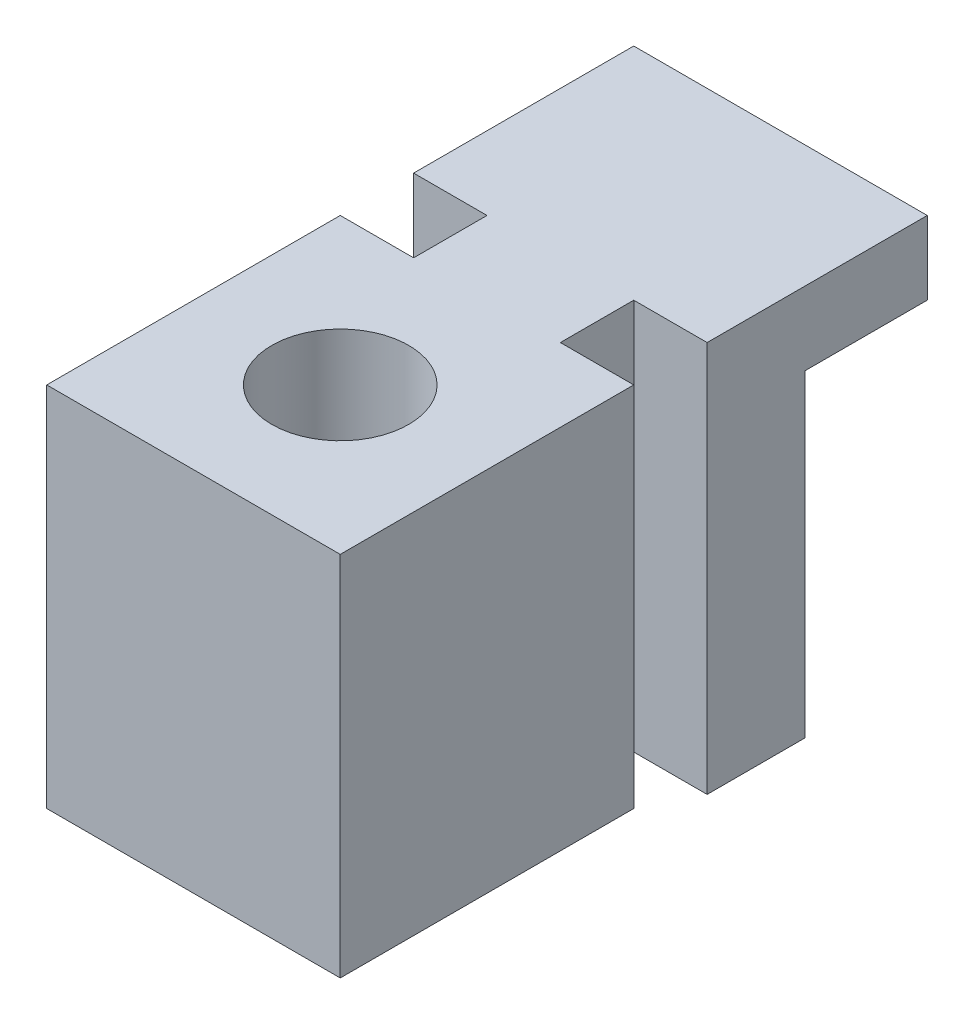
ISO-10303-21;
HEADER;
FILE_DESCRIPTION(('STEP AP214'),'2;1');
FILE_NAME('part.step','',(''),(''),'','','');
FILE_SCHEMA(('AUTOMOTIVE_DESIGN { 1 0 10303 214 1 1 1 1 }'));
ENDSEC;
DATA;
#1=APPLICATION_CONTEXT('core data for automotive mechanical design processes');
#2=APPLICATION_PROTOCOL_DEFINITION('international standard','automotive_design',2000,#1);
#3=PRODUCT_CONTEXT('',#1,'mechanical');
#4=PRODUCT('Part','Part','',(#3));
#5=PRODUCT_RELATED_PRODUCT_CATEGORY('part','',(#4));
#6=PRODUCT_DEFINITION_FORMATION('','',#4);
#7=PRODUCT_DEFINITION_CONTEXT('part definition',#1,'design');
#8=PRODUCT_DEFINITION('design','',#6,#7);
#9=PRODUCT_DEFINITION_SHAPE('','',#8);
#10=(LENGTH_UNIT() NAMED_UNIT(*) SI_UNIT(.MILLI.,.METRE.));
#11=(NAMED_UNIT(*) PLANE_ANGLE_UNIT() SI_UNIT($,.RADIAN.));
#12=(NAMED_UNIT(*) SI_UNIT($,.STERADIAN.) SOLID_ANGLE_UNIT());
#13=UNCERTAINTY_MEASURE_WITH_UNIT(LENGTH_MEASURE(1.E-05),#10,'distance_accuracy_value','');
#14=(GEOMETRIC_REPRESENTATION_CONTEXT(3) GLOBAL_UNCERTAINTY_ASSIGNED_CONTEXT((#13)) GLOBAL_UNIT_ASSIGNED_CONTEXT((#10,
#11,#12)) REPRESENTATION_CONTEXT('',''));
#15=CARTESIAN_POINT('',(0.,0.,0.));
#16=DIRECTION('',(0.,0.,1.));
#17=DIRECTION('',(1.,0.,0.));
#18=AXIS2_PLACEMENT_3D('',#15,#16,#17);
#19=CARTESIAN_POINT('',(0.,0.,0.));
#20=DIRECTION('',(0.,0.,1.));
#21=DIRECTION('',(1.,0.,0.));
#22=AXIS2_PLACEMENT_3D('',#19,#20,#21);
#23=PLANE('',#22);
#24=DIRECTION('',(-1.,0.,0.));
#25=VECTOR('',#24,1.);
#26=CARTESIAN_POINT('',(3.,3.25,0.));
#27=LINE('',#26,#25);
#28=CARTESIAN_POINT('',(3.,3.25,0.));
#29=VERTEX_POINT('',#28);
#30=CARTESIAN_POINT('',(-3.,3.25,0.));
#31=VERTEX_POINT('',#30);
#32=EDGE_CURVE('E55',#29,#31,#27,.T.);
#33=ORIENTED_EDGE('',*,*,#32,.F.);
#34=DIRECTION('',(0.,1.,0.));
#35=VECTOR('',#34,1.);
#36=CARTESIAN_POINT('',(3.,3.25,0.));
#37=LINE('',#36,#35);
#38=CARTESIAN_POINT('',(3.,-3.25,0.));
#39=VERTEX_POINT('',#38);
#40=EDGE_CURVE('E87',#39,#29,#37,.T.);
#41=ORIENTED_EDGE('',*,*,#40,.F.);
#42=DIRECTION('',(1.,0.,0.));
#43=VECTOR('',#42,1.);
#44=CARTESIAN_POINT('',(-3.,-3.25,0.));
#45=LINE('',#44,#43);
#46=CARTESIAN_POINT('',(-3.,-3.25,0.));
#47=VERTEX_POINT('',#46);
#48=EDGE_CURVE('E76',#47,#39,#45,.T.);
#49=ORIENTED_EDGE('',*,*,#48,.F.);
#50=DIRECTION('',(0.,-1.,0.));
#51=VECTOR('',#50,1.);
#52=CARTESIAN_POINT('',(-3.,3.25,0.));
#53=LINE('',#52,#51);
#54=EDGE_CURVE('E83',#31,#47,#53,.T.);
#55=ORIENTED_EDGE('',*,*,#54,.F.);
#56=EDGE_LOOP('',(#33,#41,#49,#55));
#57=FACE_BOUND('',#56,.T.);
#58=ADVANCED_FACE('F39',(#57),#23,.F.);
#59=CARTESIAN_POINT('',(3.,3.25,2.));
#60=DIRECTION('',(-1.,0.,0.));
#61=DIRECTION('',(0.,-1.,0.));
#62=AXIS2_PLACEMENT_3D('',#59,#60,#61);
#63=PLANE('',#62);
#64=ORIENTED_EDGE('',*,*,#40,.T.);
#65=DIRECTION('',(0.,0.,1.));
#66=VECTOR('',#65,1.);
#67=CARTESIAN_POINT('',(3.,3.25,-2.5));
#68=LINE('',#67,#66);
#69=CARTESIAN_POINT('',(3.,3.25,-2.5));
#70=VERTEX_POINT('',#69);
#71=EDGE_CURVE('E216',#70,#29,#68,.T.);
#72=ORIENTED_EDGE('',*,*,#71,.F.);
#73=DIRECTION('',(0.,-1.,0.));
#74=VECTOR('',#73,1.);
#75=CARTESIAN_POINT('',(3.,4.75,-2.5));
#76=LINE('',#75,#74);
#77=CARTESIAN_POINT('',(3.,4.75,-2.5));
#78=VERTEX_POINT('',#77);
#79=EDGE_CURVE('E226',#78,#70,#76,.T.);
#80=ORIENTED_EDGE('',*,*,#79,.F.);
#81=DIRECTION('',(0.,0.,-1.));
#82=VECTOR('',#81,1.);
#83=CARTESIAN_POINT('',(3.,4.75,0.));
#84=LINE('',#83,#82);
#85=CARTESIAN_POINT('',(3.,4.75,2.));
#86=VERTEX_POINT('',#85);
#87=EDGE_CURVE('E192',#86,#78,#84,.T.);
#88=ORIENTED_EDGE('',*,*,#87,.F.);
#89=DIRECTION('',(0.,1.,0.));
#90=VECTOR('',#89,1.);
#91=CARTESIAN_POINT('',(3.,3.25,2.));
#92=LINE('',#91,#90);
#93=CARTESIAN_POINT('',(3.,-3.25,2.));
#94=VERTEX_POINT('',#93);
#95=EDGE_CURVE('E82',#94,#86,#92,.T.);
#96=ORIENTED_EDGE('',*,*,#95,.F.);
#97=DIRECTION('',(0.,0.,-1.));
#98=VECTOR('',#97,1.);
#99=CARTESIAN_POINT('',(3.,-3.25,2.));
#100=LINE('',#99,#98);
#101=EDGE_CURVE('E48',#94,#39,#100,.T.);
#102=ORIENTED_EDGE('',*,*,#101,.T.);
#103=EDGE_LOOP('',(#64,#72,#80,#88,#96,#102));
#104=FACE_BOUND('',#103,.T.);
#105=ADVANCED_FACE('F41',(#104),#63,.F.);
#106=CARTESIAN_POINT('',(-3.,3.25,2.));
#107=DIRECTION('',(1.,0.,0.));
#108=DIRECTION('',(0.,1.,0.));
#109=AXIS2_PLACEMENT_3D('',#106,#107,#108);
#110=PLANE('',#109);
#111=DIRECTION('',(0.,0.,1.));
#112=VECTOR('',#111,1.);
#113=CARTESIAN_POINT('',(-3.,4.75,2.));
#114=LINE('',#113,#112);
#115=CARTESIAN_POINT('',(-3.,4.75,-2.5));
#116=VERTEX_POINT('',#115);
#117=CARTESIAN_POINT('',(-3.,4.75,2.));
#118=VERTEX_POINT('',#117);
#119=EDGE_CURVE('E188',#116,#118,#114,.T.);
#120=ORIENTED_EDGE('',*,*,#119,.F.);
#121=DIRECTION('',(0.,1.,0.));
#122=VECTOR('',#121,1.);
#123=CARTESIAN_POINT('',(-3.,4.75,-2.5));
#124=LINE('',#123,#122);
#125=CARTESIAN_POINT('',(-3.,3.25,-2.5));
#126=VERTEX_POINT('',#125);
#127=EDGE_CURVE('E230',#126,#116,#124,.T.);
#128=ORIENTED_EDGE('',*,*,#127,.F.);
#129=DIRECTION('',(0.,0.,1.));
#130=VECTOR('',#129,1.);
#131=CARTESIAN_POINT('',(-3.,3.25,-2.5));
#132=LINE('',#131,#130);
#133=EDGE_CURVE('E219',#126,#31,#132,.T.);
#134=ORIENTED_EDGE('',*,*,#133,.T.);
#135=ORIENTED_EDGE('',*,*,#54,.T.);
#136=DIRECTION('',(0.,0.,-1.));
#137=VECTOR('',#136,1.);
#138=CARTESIAN_POINT('',(-3.,-3.25,2.));
#139=LINE('',#138,#137);
#140=CARTESIAN_POINT('',(-3.,-3.25,2.));
#141=VERTEX_POINT('',#140);
#142=EDGE_CURVE('E11',#141,#47,#139,.T.);
#143=ORIENTED_EDGE('',*,*,#142,.F.);
#144=DIRECTION('',(0.,-1.,0.));
#145=VECTOR('',#144,1.);
#146=CARTESIAN_POINT('',(-3.,3.25,2.));
#147=LINE('',#146,#145);
#148=EDGE_CURVE('E103',#118,#141,#147,.T.);
#149=ORIENTED_EDGE('',*,*,#148,.F.);
#150=EDGE_LOOP('',(#120,#128,#134,#135,#143,#149));
#151=FACE_BOUND('',#150,.T.);
#152=ADVANCED_FACE('F258',(#151),#110,.F.);
#153=CARTESIAN_POINT('',(-3.,-3.25,2.));
#154=DIRECTION('',(0.,1.,0.));
#155=DIRECTION('',(0.,0.,1.));
#156=AXIS2_PLACEMENT_3D('',#153,#154,#155);
#157=PLANE('',#156);
#158=ORIENTED_EDGE('',*,*,#48,.T.);
#159=ORIENTED_EDGE('',*,*,#101,.F.);
#160=DIRECTION('',(1.,0.,0.));
#161=VECTOR('',#160,1.);
#162=CARTESIAN_POINT('',(-3.,-3.25,2.));
#163=LINE('',#162,#161);
#164=EDGE_CURVE('E64',#141,#94,#163,.T.);
#165=ORIENTED_EDGE('',*,*,#164,.F.);
#166=ORIENTED_EDGE('',*,*,#142,.T.);
#167=EDGE_LOOP('',(#158,#159,#165,#166));
#168=FACE_BOUND('',#167,.T.);
#169=ADVANCED_FACE('F78',(#168),#157,.F.);
#170=CARTESIAN_POINT('',(0.,0.,2.));
#171=DIRECTION('',(0.,0.,1.));
#172=DIRECTION('',(1.,0.,0.));
#173=AXIS2_PLACEMENT_3D('',#170,#171,#172);
#174=PLANE('',#173);
#175=DIRECTION('',(0.,1.,0.));
#176=VECTOR('',#175,1.);
#177=CARTESIAN_POINT('',(1.5,-2.75,2.));
#178=LINE('',#177,#176);
#179=CARTESIAN_POINT('',(1.5,-2.75,2.));
#180=VERTEX_POINT('',#179);
#181=CARTESIAN_POINT('',(1.5,4.75,2.));
#182=VERTEX_POINT('',#181);
#183=EDGE_CURVE('E98',#180,#182,#178,.T.);
#184=ORIENTED_EDGE('',*,*,#183,.F.);
#185=DIRECTION('',(-1.,0.,0.));
#186=VECTOR('',#185,1.);
#187=CARTESIAN_POINT('',(1.5,-2.75,2.));
#188=LINE('',#187,#186);
#189=CARTESIAN_POINT('',(-1.5,-2.75,2.));
#190=VERTEX_POINT('',#189);
#191=EDGE_CURVE('E113',#180,#190,#188,.T.);
#192=ORIENTED_EDGE('',*,*,#191,.T.);
#193=DIRECTION('',(0.,1.,0.));
#194=VECTOR('',#193,1.);
#195=CARTESIAN_POINT('',(-1.5,-2.75,2.));
#196=LINE('',#195,#194);
#197=CARTESIAN_POINT('',(-1.5,4.75,2.));
#198=VERTEX_POINT('',#197);
#199=EDGE_CURVE('E92',#190,#198,#196,.T.);
#200=ORIENTED_EDGE('',*,*,#199,.T.);
#201=DIRECTION('',(1.,0.,0.));
#202=VECTOR('',#201,1.);
#203=CARTESIAN_POINT('',(-1.5,4.75,2.));
#204=LINE('',#203,#202);
#205=EDGE_CURVE('E184',#118,#198,#204,.T.);
#206=ORIENTED_EDGE('',*,*,#205,.F.);
#207=ORIENTED_EDGE('',*,*,#148,.T.);
#208=ORIENTED_EDGE('',*,*,#164,.T.);
#209=ORIENTED_EDGE('',*,*,#95,.T.);
#210=DIRECTION('',(1.,0.,0.));
#211=VECTOR('',#210,1.);
#212=CARTESIAN_POINT('',(3.,4.75,2.));
#213=LINE('',#212,#211);
#214=EDGE_CURVE('E196',#182,#86,#213,.T.);
#215=ORIENTED_EDGE('',*,*,#214,.F.);
#216=EDGE_LOOP('',(#184,#192,#200,#206,#207,#208,#209,#215));
#217=FACE_BOUND('',#216,.T.);
#218=ADVANCED_FACE('F319',(#217),#174,.T.);
#219=CARTESIAN_POINT('',(-1.5,-2.75,3.5));
#220=DIRECTION('',(-1.,0.,0.));
#221=DIRECTION('',(0.,0.,1.));
#222=AXIS2_PLACEMENT_3D('',#219,#220,#221);
#223=PLANE('',#222);
#224=DIRECTION('',(0.,1.,0.));
#225=VECTOR('',#224,1.);
#226=CARTESIAN_POINT('',(-1.5,-2.75,3.5));
#227=LINE('',#226,#225);
#228=CARTESIAN_POINT('',(-1.5,-2.75,3.5));
#229=VERTEX_POINT('',#228);
#230=CARTESIAN_POINT('',(-1.5,4.75,3.5));
#231=VERTEX_POINT('',#230);
#232=EDGE_CURVE('E108',#229,#231,#227,.T.);
#233=ORIENTED_EDGE('',*,*,#232,.T.);
#234=DIRECTION('',(0.,0.,1.));
#235=VECTOR('',#234,1.);
#236=CARTESIAN_POINT('',(-1.5,4.75,3.5));
#237=LINE('',#236,#235);
#238=EDGE_CURVE('E180',#198,#231,#237,.T.);
#239=ORIENTED_EDGE('',*,*,#238,.F.);
#240=ORIENTED_EDGE('',*,*,#199,.F.);
#241=DIRECTION('',(0.,0.,1.));
#242=VECTOR('',#241,1.);
#243=CARTESIAN_POINT('',(-1.5,-2.75,3.5));
#244=LINE('',#243,#242);
#245=EDGE_CURVE('E127',#190,#229,#244,.T.);
#246=ORIENTED_EDGE('',*,*,#245,.T.);
#247=EDGE_LOOP('',(#233,#239,#240,#246));
#248=FACE_BOUND('',#247,.T.);
#249=ADVANCED_FACE('F309',(#248),#223,.T.);
#250=CARTESIAN_POINT('',(1.5,-2.75,3.5));
#251=DIRECTION('',(1.,0.,0.));
#252=DIRECTION('',(0.,0.,-1.));
#253=AXIS2_PLACEMENT_3D('',#250,#251,#252);
#254=PLANE('',#253);
#255=ORIENTED_EDGE('',*,*,#183,.T.);
#256=DIRECTION('',(0.,0.,-1.));
#257=VECTOR('',#256,1.);
#258=CARTESIAN_POINT('',(1.5,4.75,2.));
#259=LINE('',#258,#257);
#260=CARTESIAN_POINT('',(1.5,4.75,3.5));
#261=VERTEX_POINT('',#260);
#262=EDGE_CURVE('E200',#261,#182,#259,.T.);
#263=ORIENTED_EDGE('',*,*,#262,.F.);
#264=DIRECTION('',(0.,1.,0.));
#265=VECTOR('',#264,1.);
#266=CARTESIAN_POINT('',(1.5,-2.75,3.5));
#267=LINE('',#266,#265);
#268=CARTESIAN_POINT('',(1.5,-2.75,3.5));
#269=VERTEX_POINT('',#268);
#270=EDGE_CURVE('E112',#269,#261,#267,.T.);
#271=ORIENTED_EDGE('',*,*,#270,.F.);
#272=DIRECTION('',(0.,0.,-1.));
#273=VECTOR('',#272,1.);
#274=CARTESIAN_POINT('',(1.5,-2.75,3.5));
#275=LINE('',#274,#273);
#276=EDGE_CURVE('E123',#269,#180,#275,.T.);
#277=ORIENTED_EDGE('',*,*,#276,.T.);
#278=EDGE_LOOP('',(#255,#263,#271,#277));
#279=FACE_BOUND('',#278,.T.);
#280=ADVANCED_FACE('F322',(#279),#254,.T.);
#281=CARTESIAN_POINT('',(0.,-2.75,0.));
#282=DIRECTION('',(0.,1.,0.));
#283=DIRECTION('',(0.,0.,1.));
#284=AXIS2_PLACEMENT_3D('',#281,#282,#283);
#285=PLANE('',#284);
#286=ORIENTED_EDGE('',*,*,#245,.F.);
#287=ORIENTED_EDGE('',*,*,#191,.F.);
#288=ORIENTED_EDGE('',*,*,#276,.F.);
#289=DIRECTION('',(-1.,0.,0.));
#290=VECTOR('',#289,1.);
#291=CARTESIAN_POINT('',(-3.,-2.75,3.5));
#292=LINE('',#291,#290);
#293=CARTESIAN_POINT('',(3.,-2.75,3.5));
#294=VERTEX_POINT('',#293);
#295=EDGE_CURVE('E137',#294,#269,#292,.T.);
#296=ORIENTED_EDGE('',*,*,#295,.F.);
#297=DIRECTION('',(0.,0.,-1.));
#298=VECTOR('',#297,1.);
#299=CARTESIAN_POINT('',(3.,-2.75,3.5));
#300=LINE('',#299,#298);
#301=CARTESIAN_POINT('',(3.,-2.75,9.5));
#302=VERTEX_POINT('',#301);
#303=EDGE_CURVE('E152',#302,#294,#300,.T.);
#304=ORIENTED_EDGE('',*,*,#303,.F.);
#305=DIRECTION('',(1.,0.,0.));
#306=VECTOR('',#305,1.);
#307=CARTESIAN_POINT('',(-3.,-2.75,9.5));
#308=LINE('',#307,#306);
#309=CARTESIAN_POINT('',(-3.,-2.75,9.5));
#310=VERTEX_POINT('',#309);
#311=EDGE_CURVE('E156',#310,#302,#308,.T.);
#312=ORIENTED_EDGE('',*,*,#311,.F.);
#313=DIRECTION('',(0.,0.,1.));
#314=VECTOR('',#313,1.);
#315=CARTESIAN_POINT('',(-3.,-2.75,3.5));
#316=LINE('',#315,#314);
#317=CARTESIAN_POINT('',(-3.,-2.75,3.5));
#318=VERTEX_POINT('',#317);
#319=EDGE_CURVE('E160',#318,#310,#316,.T.);
#320=ORIENTED_EDGE('',*,*,#319,.F.);
#321=EDGE_CURVE('E151',#229,#318,#292,.T.);
#322=ORIENTED_EDGE('',*,*,#321,.F.);
#323=EDGE_LOOP('',(#286,#287,#288,#296,#304,#312,#320,#322));
#324=FACE_BOUND('',#323,.T.);
#325=CARTESIAN_POINT('',(0.,-2.75,6.5));
#326=DIRECTION('',(0.,1.,0.));
#327=DIRECTION('',(0.,0.,1.));
#328=AXIS2_PLACEMENT_3D('',#325,#326,#327);
#329=CIRCLE('',#328,1.4);
#330=CARTESIAN_POINT('',(0.,-2.75,7.9));
#331=VERTEX_POINT('',#330);
#332=EDGE_CURVE('E164',#331,#331,#329,.T.);
#333=ORIENTED_EDGE('',*,*,#332,.T.);
#334=EDGE_LOOP('',(#333));
#335=FACE_BOUND('',#334,.T.);
#336=ADVANCED_FACE('F314',(#324,#335),#285,.F.);
#337=CARTESIAN_POINT('',(-3.,-2.75,3.5));
#338=DIRECTION('',(0.,0.,-1.));
#339=DIRECTION('',(-1.,0.,0.));
#340=AXIS2_PLACEMENT_3D('',#337,#338,#339);
#341=PLANE('',#340);
#342=ORIENTED_EDGE('',*,*,#232,.F.);
#343=ORIENTED_EDGE('',*,*,#321,.T.);
#344=DIRECTION('',(0.,1.,0.));
#345=VECTOR('',#344,1.);
#346=CARTESIAN_POINT('',(-3.,-2.75,3.5));
#347=LINE('',#346,#345);
#348=CARTESIAN_POINT('',(-3.,4.75,3.5));
#349=VERTEX_POINT('',#348);
#350=EDGE_CURVE('E131',#318,#349,#347,.T.);
#351=ORIENTED_EDGE('',*,*,#350,.T.);
#352=DIRECTION('',(-1.,0.,0.));
#353=VECTOR('',#352,1.);
#354=CARTESIAN_POINT('',(-3.,4.75,3.5));
#355=LINE('',#354,#353);
#356=EDGE_CURVE('E176',#231,#349,#355,.T.);
#357=ORIENTED_EDGE('',*,*,#356,.F.);
#358=EDGE_LOOP('',(#342,#343,#351,#357));
#359=FACE_BOUND('',#358,.T.);
#360=ADVANCED_FACE('F333',(#359),#341,.T.);
#361=CARTESIAN_POINT('',(-3.,-2.75,3.5));
#362=DIRECTION('',(-1.,0.,0.));
#363=DIRECTION('',(0.,0.,1.));
#364=AXIS2_PLACEMENT_3D('',#361,#362,#363);
#365=PLANE('',#364);
#366=DIRECTION('',(0.,1.,0.));
#367=VECTOR('',#366,1.);
#368=CARTESIAN_POINT('',(-3.,-2.75,9.5));
#369=LINE('',#368,#367);
#370=CARTESIAN_POINT('',(-3.,4.75,9.5));
#371=VERTEX_POINT('',#370);
#372=EDGE_CURVE('E132',#310,#371,#369,.T.);
#373=ORIENTED_EDGE('',*,*,#372,.T.);
#374=DIRECTION('',(0.,0.,1.));
#375=VECTOR('',#374,1.);
#376=CARTESIAN_POINT('',(-3.,4.75,9.5));
#377=LINE('',#376,#375);
#378=EDGE_CURVE('E172',#349,#371,#377,.T.);
#379=ORIENTED_EDGE('',*,*,#378,.F.);
#380=ORIENTED_EDGE('',*,*,#350,.F.);
#381=ORIENTED_EDGE('',*,*,#319,.T.);
#382=EDGE_LOOP('',(#373,#379,#380,#381));
#383=FACE_BOUND('',#382,.T.);
#384=ADVANCED_FACE('F336',(#383),#365,.T.);
#385=ORIENTED_EDGE('',*,*,#295,.T.);
#386=ORIENTED_EDGE('',*,*,#270,.T.);
#387=DIRECTION('',(-1.,0.,0.));
#388=VECTOR('',#387,1.);
#389=CARTESIAN_POINT('',(1.5,4.75,3.5));
#390=LINE('',#389,#388);
#391=CARTESIAN_POINT('',(3.,4.75,3.5));
#392=VERTEX_POINT('',#391);
#393=EDGE_CURVE('E204',#392,#261,#390,.T.);
#394=ORIENTED_EDGE('',*,*,#393,.F.);
#395=DIRECTION('',(0.,1.,0.));
#396=VECTOR('',#395,1.);
#397=CARTESIAN_POINT('',(3.,-2.75,3.5));
#398=LINE('',#397,#396);
#399=EDGE_CURVE('E141',#294,#392,#398,.T.);
#400=ORIENTED_EDGE('',*,*,#399,.F.);
#401=EDGE_LOOP('',(#385,#386,#394,#400));
#402=FACE_BOUND('',#401,.T.);
#403=ADVANCED_FACE('F326',(#402),#341,.T.);
#404=CARTESIAN_POINT('',(3.,-2.75,3.5));
#405=DIRECTION('',(1.,0.,0.));
#406=DIRECTION('',(0.,0.,-1.));
#407=AXIS2_PLACEMENT_3D('',#404,#405,#406);
#408=PLANE('',#407);
#409=ORIENTED_EDGE('',*,*,#399,.T.);
#410=DIRECTION('',(0.,0.,-1.));
#411=VECTOR('',#410,1.);
#412=CARTESIAN_POINT('',(3.,4.75,3.5));
#413=LINE('',#412,#411);
#414=CARTESIAN_POINT('',(3.,4.75,9.5));
#415=VERTEX_POINT('',#414);
#416=EDGE_CURVE('E208',#415,#392,#413,.T.);
#417=ORIENTED_EDGE('',*,*,#416,.F.);
#418=DIRECTION('',(0.,1.,0.));
#419=VECTOR('',#418,1.);
#420=CARTESIAN_POINT('',(3.,-2.75,9.5));
#421=LINE('',#420,#419);
#422=EDGE_CURVE('E136',#302,#415,#421,.T.);
#423=ORIENTED_EDGE('',*,*,#422,.F.);
#424=ORIENTED_EDGE('',*,*,#303,.T.);
#425=EDGE_LOOP('',(#409,#417,#423,#424));
#426=FACE_BOUND('',#425,.T.);
#427=ADVANCED_FACE('F343',(#426),#408,.T.);
#428=CARTESIAN_POINT('',(-3.,-2.75,9.5));
#429=DIRECTION('',(0.,0.,1.));
#430=DIRECTION('',(1.,0.,0.));
#431=AXIS2_PLACEMENT_3D('',#428,#429,#430);
#432=PLANE('',#431);
#433=ORIENTED_EDGE('',*,*,#422,.T.);
#434=DIRECTION('',(1.,0.,0.));
#435=VECTOR('',#434,1.);
#436=CARTESIAN_POINT('',(3.,4.75,9.5));
#437=LINE('',#436,#435);
#438=EDGE_CURVE('E168',#371,#415,#437,.T.);
#439=ORIENTED_EDGE('',*,*,#438,.F.);
#440=ORIENTED_EDGE('',*,*,#372,.F.);
#441=ORIENTED_EDGE('',*,*,#311,.T.);
#442=EDGE_LOOP('',(#433,#439,#440,#441));
#443=FACE_BOUND('',#442,.T.);
#444=ADVANCED_FACE('F341',(#443),#432,.T.);
#445=CARTESIAN_POINT('',(0.,-2.75,6.5));
#446=DIRECTION('',(0.,1.,0.));
#447=DIRECTION('',(0.,0.,1.));
#448=AXIS2_PLACEMENT_3D('',#445,#446,#447);
#449=CYLINDRICAL_SURFACE('',#448,1.4);
#450=ORIENTED_EDGE('',*,*,#332,.F.);
#451=EDGE_LOOP('',(#450));
#452=FACE_BOUND('',#451,.T.);
#453=CARTESIAN_POINT('',(0.,4.75,6.5));
#454=DIRECTION('',(0.,1.,0.));
#455=DIRECTION('',(0.,0.,1.));
#456=AXIS2_PLACEMENT_3D('',#453,#454,#455);
#457=CIRCLE('',#456,1.4);
#458=CARTESIAN_POINT('',(0.,4.75,7.9));
#459=VERTEX_POINT('',#458);
#460=EDGE_CURVE('E212',#459,#459,#457,.T.);
#461=ORIENTED_EDGE('',*,*,#460,.T.);
#462=EDGE_LOOP('',(#461));
#463=FACE_BOUND('',#462,.T.);
#464=ADVANCED_FACE('F350',(#452,#463),#449,.F.);
#465=CARTESIAN_POINT('',(0.,4.75,0.));
#466=DIRECTION('',(0.,-1.,0.));
#467=DIRECTION('',(0.,0.,-1.));
#468=AXIS2_PLACEMENT_3D('',#465,#466,#467);
#469=PLANE('',#468);
#470=ORIENTED_EDGE('',*,*,#416,.T.);
#471=ORIENTED_EDGE('',*,*,#393,.T.);
#472=ORIENTED_EDGE('',*,*,#262,.T.);
#473=ORIENTED_EDGE('',*,*,#214,.T.);
#474=ORIENTED_EDGE('',*,*,#87,.T.);
#475=DIRECTION('',(1.,0.,0.));
#476=VECTOR('',#475,1.);
#477=CARTESIAN_POINT('',(3.,4.75,-2.5));
#478=LINE('',#477,#476);
#479=EDGE_CURVE('E223',#116,#78,#478,.T.);
#480=ORIENTED_EDGE('',*,*,#479,.F.);
#481=ORIENTED_EDGE('',*,*,#119,.T.);
#482=ORIENTED_EDGE('',*,*,#205,.T.);
#483=ORIENTED_EDGE('',*,*,#238,.T.);
#484=ORIENTED_EDGE('',*,*,#356,.T.);
#485=ORIENTED_EDGE('',*,*,#378,.T.);
#486=ORIENTED_EDGE('',*,*,#438,.T.);
#487=EDGE_LOOP('',(#470,#471,#472,#473,#474,#480,#481,#482,#483,#484,#485,#486));
#488=FACE_BOUND('',#487,.T.);
#489=ORIENTED_EDGE('',*,*,#460,.F.);
#490=EDGE_LOOP('',(#489));
#491=FACE_BOUND('',#490,.T.);
#492=ADVANCED_FACE('F262',(#488,#491),#469,.F.);
#493=CARTESIAN_POINT('',(3.,3.25,-2.5));
#494=DIRECTION('',(0.,1.,0.));
#495=DIRECTION('',(0.,0.,1.));
#496=AXIS2_PLACEMENT_3D('',#493,#494,#495);
#497=PLANE('',#496);
#498=ORIENTED_EDGE('',*,*,#32,.T.);
#499=ORIENTED_EDGE('',*,*,#133,.F.);
#500=DIRECTION('',(-1.,0.,0.));
#501=VECTOR('',#500,1.);
#502=CARTESIAN_POINT('',(3.,3.25,-2.5));
#503=LINE('',#502,#501);
#504=EDGE_CURVE('E234',#70,#126,#503,.T.);
#505=ORIENTED_EDGE('',*,*,#504,.F.);
#506=ORIENTED_EDGE('',*,*,#71,.T.);
#507=EDGE_LOOP('',(#498,#499,#505,#506));
#508=FACE_BOUND('',#507,.T.);
#509=ADVANCED_FACE('F252',(#508),#497,.F.);
#510=CARTESIAN_POINT('',(0.,0.,-2.5));
#511=DIRECTION('',(0.,0.,-1.));
#512=DIRECTION('',(-1.,0.,0.));
#513=AXIS2_PLACEMENT_3D('',#510,#511,#512);
#514=PLANE('',#513);
#515=ORIENTED_EDGE('',*,*,#79,.T.);
#516=ORIENTED_EDGE('',*,*,#504,.T.);
#517=ORIENTED_EDGE('',*,*,#127,.T.);
#518=ORIENTED_EDGE('',*,*,#479,.T.);
#519=EDGE_LOOP('',(#515,#516,#517,#518));
#520=FACE_BOUND('',#519,.T.);
#521=ADVANCED_FACE('F243',(#520),#514,.T.);
#522=CLOSED_SHELL('',(#58,#105,#152,#169,#218,#249,#280,#336,#360,#384,#403,#427,#444,#464,#492,
#509,#521));
#523=MANIFOLD_SOLID_BREP('B2',#522);
#524=ADVANCED_BREP_SHAPE_REPRESENTATION('',(#18,#523),#14);
#525=SHAPE_DEFINITION_REPRESENTATION(#9,#524);
ENDSEC;
END-ISO-10303-21;
